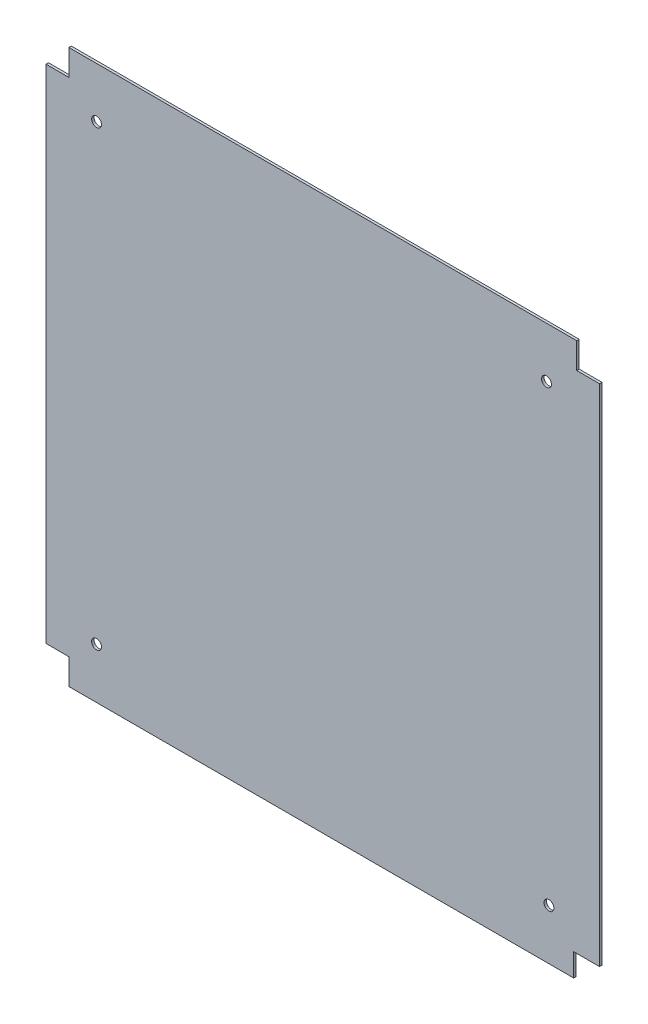
ISO-10303-21;
HEADER;
FILE_DESCRIPTION(('STEP AP214'),'2;1');
FILE_NAME('part.step','',(''),(''),'','','');
FILE_SCHEMA(('AUTOMOTIVE_DESIGN { 1 0 10303 214 1 1 1 1 }'));
ENDSEC;
DATA;
#1=APPLICATION_CONTEXT('core data for automotive mechanical design processes');
#2=APPLICATION_PROTOCOL_DEFINITION('international standard','automotive_design',2000,#1);
#3=PRODUCT_CONTEXT('',#1,'mechanical');
#4=PRODUCT('Part','Part','',(#3));
#5=PRODUCT_RELATED_PRODUCT_CATEGORY('part','',(#4));
#6=PRODUCT_DEFINITION_FORMATION('','',#4);
#7=PRODUCT_DEFINITION_CONTEXT('part definition',#1,'design');
#8=PRODUCT_DEFINITION('design','',#6,#7);
#9=PRODUCT_DEFINITION_SHAPE('','',#8);
#10=(LENGTH_UNIT() NAMED_UNIT(*) SI_UNIT(.MILLI.,.METRE.));
#11=(NAMED_UNIT(*) PLANE_ANGLE_UNIT() SI_UNIT($,.RADIAN.));
#12=(NAMED_UNIT(*) SI_UNIT($,.STERADIAN.) SOLID_ANGLE_UNIT());
#13=UNCERTAINTY_MEASURE_WITH_UNIT(LENGTH_MEASURE(1.E-05),#10,'distance_accuracy_value','');
#14=(GEOMETRIC_REPRESENTATION_CONTEXT(3) GLOBAL_UNCERTAINTY_ASSIGNED_CONTEXT((#13)) GLOBAL_UNIT_ASSIGNED_CONTEXT((#10,
#11,#12)) REPRESENTATION_CONTEXT('',''));
#15=CARTESIAN_POINT('',(0.,0.,0.));
#16=DIRECTION('',(0.,0.,1.));
#17=DIRECTION('',(1.,0.,0.));
#18=AXIS2_PLACEMENT_3D('',#15,#16,#17);
#19=CARTESIAN_POINT('',(0.,0.,-2.));
#20=DIRECTION('',(0.,0.,-1.));
#21=DIRECTION('',(-1.,0.,0.));
#22=AXIS2_PLACEMENT_3D('',#19,#20,#21);
#23=PLANE('',#22);
#24=DIRECTION('',(0.,1.,0.));
#25=VECTOR('',#24,1.);
#26=CARTESIAN_POINT('',(-205.,-207.248893571891,-2.00000000000002));
#27=LINE('',#26,#25);
#28=CARTESIAN_POINT('',(-205.,-225.497787143782,-2.00000000000017));
#29=VERTEX_POINT('',#28);
#30=CARTESIAN_POINT('',(-205.,-204.5,-2.00000000000002));
#31=VERTEX_POINT('',#30);
#32=EDGE_CURVE('E226',#29,#31,#27,.T.);
#33=ORIENTED_EDGE('',*,*,#32,.T.);
#34=DIRECTION('',(-1.,0.,0.));
#35=VECTOR('',#34,1.);
#36=CARTESIAN_POINT('',(-205.248893571891,-204.5,-2.00000000000005));
#37=LINE('',#36,#35);
#38=CARTESIAN_POINT('',(-223.497787143782,-204.5,-2.00000000000014));
#39=VERTEX_POINT('',#38);
#40=EDGE_CURVE('E91',#31,#39,#37,.T.);
#41=ORIENTED_EDGE('',*,*,#40,.T.);
#42=DIRECTION('',(0.,-1.,0.));
#43=VECTOR('',#42,1.);
#44=CARTESIAN_POINT('',(-223.497787143782,-204.5,-2.00000000000014));
#45=LINE('',#44,#43);
#46=CARTESIAN_POINT('',(-223.497787143782,202.5,-2.00000000000025));
#47=VERTEX_POINT('',#46);
#48=EDGE_CURVE('E229',#47,#39,#45,.T.);
#49=ORIENTED_EDGE('',*,*,#48,.F.);
#50=DIRECTION('',(-1.,0.,0.));
#51=VECTOR('',#50,1.);
#52=CARTESIAN_POINT('',(-205.248893571891,202.5,-2.00000000000005));
#53=LINE('',#52,#51);
#54=CARTESIAN_POINT('',(-205.,202.5,-2.00000000000003));
#55=VERTEX_POINT('',#54);
#56=EDGE_CURVE('E78',#47,#55,#53,.F.);
#57=ORIENTED_EDGE('',*,*,#56,.T.);
#58=DIRECTION('',(0.,1.,0.));
#59=VECTOR('',#58,1.);
#60=CARTESIAN_POINT('',(-205.,205.248893571891,-2.00000000000003));
#61=LINE('',#60,#59);
#62=CARTESIAN_POINT('',(-205.,223.497787143782,-2.00000000000017));
#63=VERTEX_POINT('',#62);
#64=EDGE_CURVE('E169',#55,#63,#61,.T.);
#65=ORIENTED_EDGE('',*,*,#64,.T.);
#66=DIRECTION('',(-1.,0.,0.));
#67=VECTOR('',#66,1.);
#68=CARTESIAN_POINT('',(-205.,223.497787143782,-2.00000000000017));
#69=LINE('',#68,#67);
#70=CARTESIAN_POINT('',(207.,223.497787143782,-2.00000000000014));
#71=VERTEX_POINT('',#70);
#72=EDGE_CURVE('E175',#71,#63,#69,.T.);
#73=ORIENTED_EDGE('',*,*,#72,.F.);
#74=DIRECTION('',(0.,1.,0.));
#75=VECTOR('',#74,1.);
#76=CARTESIAN_POINT('',(207.,205.248893571891,-2.00000000000003));
#77=LINE('',#76,#75);
#78=CARTESIAN_POINT('',(207.,202.5,-2.00000000000003));
#79=VERTEX_POINT('',#78);
#80=EDGE_CURVE('E160',#71,#79,#77,.F.);
#81=ORIENTED_EDGE('',*,*,#80,.T.);
#82=DIRECTION('',(-1.,0.,0.));
#83=VECTOR('',#82,1.);
#84=CARTESIAN_POINT('',(207.248893571891,202.5,-1.99999999999999));
#85=LINE('',#84,#83);
#86=CARTESIAN_POINT('',(225.497787143782,202.5,-2.00000000000014));
#87=VERTEX_POINT('',#86);
#88=EDGE_CURVE('E203',#79,#87,#85,.F.);
#89=ORIENTED_EDGE('',*,*,#88,.T.);
#90=DIRECTION('',(0.,1.,0.));
#91=VECTOR('',#90,1.);
#92=CARTESIAN_POINT('',(225.497787143782,202.5,-2.00000000000014));
#93=LINE('',#92,#91);
#94=CARTESIAN_POINT('',(225.497787143782,-207.,-2.0000000000002));
#95=VERTEX_POINT('',#94);
#96=EDGE_CURVE('E168',#95,#87,#93,.T.);
#97=ORIENTED_EDGE('',*,*,#96,.F.);
#98=DIRECTION('',(-1.,0.,0.));
#99=VECTOR('',#98,1.);
#100=CARTESIAN_POINT('',(207.248893571891,-207.,-1.99999999999999));
#101=LINE('',#100,#99);
#102=CARTESIAN_POINT('',(204.5,-207.,-1.99999999999999));
#103=VERTEX_POINT('',#102);
#104=EDGE_CURVE('E205',#95,#103,#101,.T.);
#105=ORIENTED_EDGE('',*,*,#104,.T.);
#106=DIRECTION('',(0.,1.,0.));
#107=VECTOR('',#106,1.);
#108=CARTESIAN_POINT('',(204.5,-207.248893571891,-2.00000000000002));
#109=LINE('',#108,#107);
#110=CARTESIAN_POINT('',(204.5,-225.497787143782,-2.00000000000011));
#111=VERTEX_POINT('',#110);
#112=EDGE_CURVE('E224',#103,#111,#109,.F.);
#113=ORIENTED_EDGE('',*,*,#112,.T.);
#114=DIRECTION('',(1.,0.,0.));
#115=VECTOR('',#114,1.);
#116=CARTESIAN_POINT('',(204.5,-225.497787143782,-2.00000000000011));
#117=LINE('',#116,#115);
#118=EDGE_CURVE('E209',#29,#111,#117,.T.);
#119=ORIENTED_EDGE('',*,*,#118,.F.);
#120=EDGE_LOOP('',(#33,#41,#49,#57,#65,#73,#81,#89,#97,#105,#113,#119));
#121=FACE_BOUND('',#120,.T.);
#122=CARTESIAN_POINT('',(-182.5,-184.5,-2.));
#123=DIRECTION('',(0.,0.,-1.));
#124=DIRECTION('',(-1.,0.,0.));
#125=AXIS2_PLACEMENT_3D('',#122,#123,#124);
#126=CIRCLE('',#125,3.99999999999999);
#127=CARTESIAN_POINT('',(-186.5,-184.5,-2.));
#128=VERTEX_POINT('',#127);
#129=EDGE_CURVE('E248',#128,#128,#126,.T.);
#130=ORIENTED_EDGE('',*,*,#129,.F.);
#131=EDGE_LOOP('',(#130));
#132=FACE_BOUND('',#131,.T.);
#133=CARTESIAN_POINT('',(-182.5,182.5,-2.));
#134=DIRECTION('',(0.,0.,-1.));
#135=DIRECTION('',(-1.,0.,0.));
#136=AXIS2_PLACEMENT_3D('',#133,#134,#135);
#137=CIRCLE('',#136,3.99999999999999);
#138=CARTESIAN_POINT('',(-186.5,182.5,-2.));
#139=VERTEX_POINT('',#138);
#140=EDGE_CURVE('E252',#139,#139,#137,.T.);
#141=ORIENTED_EDGE('',*,*,#140,.F.);
#142=EDGE_LOOP('',(#141));
#143=FACE_BOUND('',#142,.T.);
#144=CARTESIAN_POINT('',(182.5,182.5,-2.));
#145=DIRECTION('',(0.,0.,-1.));
#146=DIRECTION('',(-1.,0.,0.));
#147=AXIS2_PLACEMENT_3D('',#144,#145,#146);
#148=CIRCLE('',#147,3.99999999999999);
#149=CARTESIAN_POINT('',(178.5,182.5,-2.));
#150=VERTEX_POINT('',#149);
#151=EDGE_CURVE('E244',#150,#150,#148,.T.);
#152=ORIENTED_EDGE('',*,*,#151,.F.);
#153=EDGE_LOOP('',(#152));
#154=FACE_BOUND('',#153,.T.);
#155=CARTESIAN_POINT('',(184.5,-184.5,-2.));
#156=DIRECTION('',(0.,0.,-1.));
#157=DIRECTION('',(-1.,0.,0.));
#158=AXIS2_PLACEMENT_3D('',#155,#156,#157);
#159=CIRCLE('',#158,3.99999999999999);
#160=CARTESIAN_POINT('',(180.5,-184.5,-2.));
#161=VERTEX_POINT('',#160);
#162=EDGE_CURVE('E257',#161,#161,#159,.T.);
#163=ORIENTED_EDGE('',*,*,#162,.F.);
#164=EDGE_LOOP('',(#163));
#165=FACE_BOUND('',#164,.T.);
#166=ADVANCED_FACE('F61',(#121,#132,#143,#154,#165),#23,.T.);
#167=CARTESIAN_POINT('',(0.,0.,0.));
#168=DIRECTION('',(0.,0.,-1.));
#169=DIRECTION('',(-1.,0.,0.));
#170=AXIS2_PLACEMENT_3D('',#167,#168,#169);
#171=PLANE('',#170);
#172=DIRECTION('',(-1.,0.,0.));
#173=VECTOR('',#172,1.);
#174=CARTESIAN_POINT('',(-205.248893571891,-204.5,0.));
#175=LINE('',#174,#173);
#176=CARTESIAN_POINT('',(-205.,-204.5,0.));
#177=VERTEX_POINT('',#176);
#178=CARTESIAN_POINT('',(-223.497787143782,-204.5,-1.38777878078145E-13));
#179=VERTEX_POINT('',#178);
#180=EDGE_CURVE('E98',#177,#179,#175,.T.);
#181=ORIENTED_EDGE('',*,*,#180,.F.);
#182=DIRECTION('',(0.,1.,0.));
#183=VECTOR('',#182,1.);
#184=CARTESIAN_POINT('',(-205.,-207.248893571891,0.));
#185=LINE('',#184,#183);
#186=CARTESIAN_POINT('',(-205.,-225.497787143782,-1.66533453693773E-13));
#187=VERTEX_POINT('',#186);
#188=EDGE_CURVE('E227',#187,#177,#185,.T.);
#189=ORIENTED_EDGE('',*,*,#188,.F.);
#190=DIRECTION('',(1.,0.,0.));
#191=VECTOR('',#190,1.);
#192=CARTESIAN_POINT('',(204.5,-225.497787143782,-1.11022302462516E-13));
#193=LINE('',#192,#191);
#194=CARTESIAN_POINT('',(204.5,-225.497787143782,-1.11022302462516E-13));
#195=VERTEX_POINT('',#194);
#196=EDGE_CURVE('E216',#187,#195,#193,.T.);
#197=ORIENTED_EDGE('',*,*,#196,.T.);
#198=DIRECTION('',(0.,1.,0.));
#199=VECTOR('',#198,1.);
#200=CARTESIAN_POINT('',(204.5,-207.248893571891,0.));
#201=LINE('',#200,#199);
#202=CARTESIAN_POINT('',(204.5,-207.,0.));
#203=VERTEX_POINT('',#202);
#204=EDGE_CURVE('E215',#203,#195,#201,.F.);
#205=ORIENTED_EDGE('',*,*,#204,.F.);
#206=DIRECTION('',(-1.,0.,0.));
#207=VECTOR('',#206,1.);
#208=CARTESIAN_POINT('',(207.248893571891,-207.,0.));
#209=LINE('',#208,#207);
#210=CARTESIAN_POINT('',(225.497787143782,-207.,-1.94289029309402E-13));
#211=VERTEX_POINT('',#210);
#212=EDGE_CURVE('E206',#211,#203,#209,.T.);
#213=ORIENTED_EDGE('',*,*,#212,.F.);
#214=DIRECTION('',(0.,1.,0.));
#215=VECTOR('',#214,1.);
#216=CARTESIAN_POINT('',(225.497787143782,202.5,-1.38777878078145E-13));
#217=LINE('',#216,#215);
#218=CARTESIAN_POINT('',(225.497787143782,202.5,-1.38777878078145E-13));
#219=VERTEX_POINT('',#218);
#220=EDGE_CURVE('E195',#211,#219,#217,.T.);
#221=ORIENTED_EDGE('',*,*,#220,.T.);
#222=DIRECTION('',(-1.,0.,0.));
#223=VECTOR('',#222,1.);
#224=CARTESIAN_POINT('',(207.248893571891,202.5,0.));
#225=LINE('',#224,#223);
#226=CARTESIAN_POINT('',(207.,202.5,0.));
#227=VERTEX_POINT('',#226);
#228=EDGE_CURVE('E194',#227,#219,#225,.F.);
#229=ORIENTED_EDGE('',*,*,#228,.F.);
#230=DIRECTION('',(0.,1.,0.));
#231=VECTOR('',#230,1.);
#232=CARTESIAN_POINT('',(207.,205.248893571891,0.));
#233=LINE('',#232,#231);
#234=CARTESIAN_POINT('',(207.,223.497787143782,-1.38777878078145E-13));
#235=VERTEX_POINT('',#234);
#236=EDGE_CURVE('E187',#235,#227,#233,.F.);
#237=ORIENTED_EDGE('',*,*,#236,.F.);
#238=DIRECTION('',(-1.,0.,0.));
#239=VECTOR('',#238,1.);
#240=CARTESIAN_POINT('',(-205.,223.497787143782,-1.66533453693773E-13));
#241=LINE('',#240,#239);
#242=CARTESIAN_POINT('',(-205.,223.497787143782,-1.66533453693773E-13));
#243=VERTEX_POINT('',#242);
#244=EDGE_CURVE('E177',#235,#243,#241,.T.);
#245=ORIENTED_EDGE('',*,*,#244,.T.);
#246=DIRECTION('',(0.,1.,0.));
#247=VECTOR('',#246,1.);
#248=CARTESIAN_POINT('',(-205.,205.248893571891,0.));
#249=LINE('',#248,#247);
#250=CARTESIAN_POINT('',(-205.,202.5,0.));
#251=VERTEX_POINT('',#250);
#252=EDGE_CURVE('E178',#251,#243,#249,.T.);
#253=ORIENTED_EDGE('',*,*,#252,.F.);
#254=DIRECTION('',(-1.,0.,0.));
#255=VECTOR('',#254,1.);
#256=CARTESIAN_POINT('',(-205.248893571891,202.5,0.));
#257=LINE('',#256,#255);
#258=CARTESIAN_POINT('',(-223.497787143782,202.5,-2.4980018054066E-13));
#259=VERTEX_POINT('',#258);
#260=EDGE_CURVE('E242',#259,#251,#257,.F.);
#261=ORIENTED_EDGE('',*,*,#260,.F.);
#262=DIRECTION('',(0.,-1.,0.));
#263=VECTOR('',#262,1.);
#264=CARTESIAN_POINT('',(-223.497787143782,-204.5,-1.38777878078145E-13));
#265=LINE('',#264,#263);
#266=EDGE_CURVE('E234',#259,#179,#265,.T.);
#267=ORIENTED_EDGE('',*,*,#266,.T.);
#268=EDGE_LOOP('',(#181,#189,#197,#205,#213,#221,#229,#237,#245,#253,#261,#267));
#269=FACE_BOUND('',#268,.T.);
#270=CARTESIAN_POINT('',(-182.5,-184.5,0.));
#271=DIRECTION('',(0.,0.,-1.));
#272=DIRECTION('',(-1.,0.,0.));
#273=AXIS2_PLACEMENT_3D('',#270,#271,#272);
#274=CIRCLE('',#273,3.99999999999999);
#275=CARTESIAN_POINT('',(-186.5,-184.5,0.));
#276=VERTEX_POINT('',#275);
#277=EDGE_CURVE('E261',#276,#276,#274,.T.);
#278=ORIENTED_EDGE('',*,*,#277,.T.);
#279=EDGE_LOOP('',(#278));
#280=FACE_BOUND('',#279,.T.);
#281=CARTESIAN_POINT('',(-182.5,182.5,0.));
#282=DIRECTION('',(0.,0.,-1.));
#283=DIRECTION('',(-1.,0.,0.));
#284=AXIS2_PLACEMENT_3D('',#281,#282,#283);
#285=CIRCLE('',#284,3.99999999999999);
#286=CARTESIAN_POINT('',(-186.5,182.5,0.));
#287=VERTEX_POINT('',#286);
#288=EDGE_CURVE('E266',#287,#287,#285,.T.);
#289=ORIENTED_EDGE('',*,*,#288,.T.);
#290=EDGE_LOOP('',(#289));
#291=FACE_BOUND('',#290,.T.);
#292=CARTESIAN_POINT('',(182.5,182.5,0.));
#293=DIRECTION('',(0.,0.,-1.));
#294=DIRECTION('',(-1.,0.,0.));
#295=AXIS2_PLACEMENT_3D('',#292,#293,#294);
#296=CIRCLE('',#295,3.99999999999999);
#297=CARTESIAN_POINT('',(178.5,182.5,0.));
#298=VERTEX_POINT('',#297);
#299=EDGE_CURVE('E251',#298,#298,#296,.T.);
#300=ORIENTED_EDGE('',*,*,#299,.T.);
#301=EDGE_LOOP('',(#300));
#302=FACE_BOUND('',#301,.T.);
#303=CARTESIAN_POINT('',(184.5,-184.5,0.));
#304=DIRECTION('',(0.,0.,-1.));
#305=DIRECTION('',(-1.,0.,0.));
#306=AXIS2_PLACEMENT_3D('',#303,#304,#305);
#307=CIRCLE('',#306,3.99999999999999);
#308=CARTESIAN_POINT('',(180.5,-184.5,0.));
#309=VERTEX_POINT('',#308);
#310=EDGE_CURVE('E260',#309,#309,#307,.T.);
#311=ORIENTED_EDGE('',*,*,#310,.T.);
#312=EDGE_LOOP('',(#311));
#313=FACE_BOUND('',#312,.T.);
#314=ADVANCED_FACE('F63',(#269,#280,#291,#302,#313),#171,.F.);
#315=CARTESIAN_POINT('',(184.5,-184.5,8.));
#316=DIRECTION('',(0.,0.,-1.));
#317=DIRECTION('',(-1.,0.,0.));
#318=AXIS2_PLACEMENT_3D('',#315,#316,#317);
#319=CYLINDRICAL_SURFACE('',#318,3.99999999999999);
#320=ORIENTED_EDGE('',*,*,#162,.T.);
#321=EDGE_LOOP('',(#320));
#322=FACE_BOUND('',#321,.T.);
#323=ORIENTED_EDGE('',*,*,#310,.F.);
#324=EDGE_LOOP('',(#323));
#325=FACE_BOUND('',#324,.T.);
#326=ADVANCED_FACE('F323',(#322,#325),#319,.F.);
#327=CARTESIAN_POINT('',(182.5,182.5,8.));
#328=DIRECTION('',(0.,0.,-1.));
#329=DIRECTION('',(-1.,0.,0.));
#330=AXIS2_PLACEMENT_3D('',#327,#328,#329);
#331=CYLINDRICAL_SURFACE('',#330,3.99999999999999);
#332=ORIENTED_EDGE('',*,*,#151,.T.);
#333=EDGE_LOOP('',(#332));
#334=FACE_BOUND('',#333,.T.);
#335=ORIENTED_EDGE('',*,*,#299,.F.);
#336=EDGE_LOOP('',(#335));
#337=FACE_BOUND('',#336,.T.);
#338=ADVANCED_FACE('F327',(#334,#337),#331,.F.);
#339=CARTESIAN_POINT('',(-182.5,182.5,8.));
#340=DIRECTION('',(0.,0.,-1.));
#341=DIRECTION('',(-1.,0.,0.));
#342=AXIS2_PLACEMENT_3D('',#339,#340,#341);
#343=CYLINDRICAL_SURFACE('',#342,3.99999999999999);
#344=ORIENTED_EDGE('',*,*,#140,.T.);
#345=EDGE_LOOP('',(#344));
#346=FACE_BOUND('',#345,.T.);
#347=ORIENTED_EDGE('',*,*,#288,.F.);
#348=EDGE_LOOP('',(#347));
#349=FACE_BOUND('',#348,.T.);
#350=ADVANCED_FACE('F331',(#346,#349),#343,.F.);
#351=CARTESIAN_POINT('',(-182.5,-184.5,8.));
#352=DIRECTION('',(0.,0.,-1.));
#353=DIRECTION('',(-1.,0.,0.));
#354=AXIS2_PLACEMENT_3D('',#351,#352,#353);
#355=CYLINDRICAL_SURFACE('',#354,3.99999999999999);
#356=ORIENTED_EDGE('',*,*,#129,.T.);
#357=EDGE_LOOP('',(#356));
#358=FACE_BOUND('',#357,.T.);
#359=ORIENTED_EDGE('',*,*,#277,.F.);
#360=EDGE_LOOP('',(#359));
#361=FACE_BOUND('',#360,.T.);
#362=ADVANCED_FACE('F335',(#358,#361),#355,.F.);
#363=CARTESIAN_POINT('',(-205.248893571891,-204.5,-1.00000000000005));
#364=DIRECTION('',(0.,-1.,0.));
#365=DIRECTION('',(-1.,0.,0.));
#366=AXIS2_PLACEMENT_3D('',#363,#364,#365);
#367=PLANE('',#366);
#368=DIRECTION('',(0.,0.,-1.));
#369=VECTOR('',#368,1.);
#370=CARTESIAN_POINT('',(-205.,-204.5,0.));
#371=LINE('',#370,#369);
#372=EDGE_CURVE('E104',#177,#31,#371,.T.);
#373=ORIENTED_EDGE('',*,*,#372,.F.);
#374=ORIENTED_EDGE('',*,*,#180,.T.);
#375=DIRECTION('',(0.,0.,1.));
#376=VECTOR('',#375,1.);
#377=CARTESIAN_POINT('',(-223.497787143782,-204.5,-2.00000000000014));
#378=LINE('',#377,#376);
#379=EDGE_CURVE('E237',#39,#179,#378,.T.);
#380=ORIENTED_EDGE('',*,*,#379,.F.);
#381=ORIENTED_EDGE('',*,*,#40,.F.);
#382=EDGE_LOOP('',(#373,#374,#380,#381));
#383=FACE_BOUND('',#382,.T.);
#384=ADVANCED_FACE('F303',(#383),#367,.T.);
#385=CARTESIAN_POINT('',(-205.248893571891,202.5,-1.00000000000005));
#386=DIRECTION('',(0.,-1.,0.));
#387=DIRECTION('',(-1.,0.,0.));
#388=AXIS2_PLACEMENT_3D('',#385,#386,#387);
#389=PLANE('',#388);
#390=ORIENTED_EDGE('',*,*,#260,.T.);
#391=DIRECTION('',(0.,0.,-1.));
#392=VECTOR('',#391,1.);
#393=CARTESIAN_POINT('',(-205.,202.5,0.));
#394=LINE('',#393,#392);
#395=EDGE_CURVE('E70',#251,#55,#394,.T.);
#396=ORIENTED_EDGE('',*,*,#395,.T.);
#397=ORIENTED_EDGE('',*,*,#56,.F.);
#398=DIRECTION('',(0.,0.,1.));
#399=VECTOR('',#398,1.);
#400=CARTESIAN_POINT('',(-223.497787143782,202.5,-2.00000000000025));
#401=LINE('',#400,#399);
#402=EDGE_CURVE('E232',#47,#259,#401,.T.);
#403=ORIENTED_EDGE('',*,*,#402,.T.);
#404=EDGE_LOOP('',(#390,#396,#397,#403));
#405=FACE_BOUND('',#404,.T.);
#406=ADVANCED_FACE('F273',(#405),#389,.F.);
#407=CARTESIAN_POINT('',(-223.497787143782,-204.5,-2.00000000000014));
#408=DIRECTION('',(-1.,0.,0.));
#409=DIRECTION('',(0.,0.,1.));
#410=AXIS2_PLACEMENT_3D('',#407,#408,#409);
#411=PLANE('',#410);
#412=ORIENTED_EDGE('',*,*,#266,.F.);
#413=ORIENTED_EDGE('',*,*,#402,.F.);
#414=ORIENTED_EDGE('',*,*,#48,.T.);
#415=ORIENTED_EDGE('',*,*,#379,.T.);
#416=EDGE_LOOP('',(#412,#413,#414,#415));
#417=FACE_BOUND('',#416,.T.);
#418=ADVANCED_FACE('F305',(#417),#411,.T.);
#419=CARTESIAN_POINT('',(204.5,-207.248893571891,-1.00000000000002));
#420=DIRECTION('',(-1.,0.,0.));
#421=DIRECTION('',(0.,1.,0.));
#422=AXIS2_PLACEMENT_3D('',#419,#420,#421);
#423=PLANE('',#422);
#424=DIRECTION('',(0.,0.,-1.));
#425=VECTOR('',#424,1.);
#426=CARTESIAN_POINT('',(204.5,-207.,0.));
#427=LINE('',#426,#425);
#428=EDGE_CURVE('E272',#203,#103,#427,.T.);
#429=ORIENTED_EDGE('',*,*,#428,.F.);
#430=ORIENTED_EDGE('',*,*,#204,.T.);
#431=DIRECTION('',(0.,0.,1.));
#432=VECTOR('',#431,1.);
#433=CARTESIAN_POINT('',(204.5,-225.497787143782,-2.00000000000011));
#434=LINE('',#433,#432);
#435=EDGE_CURVE('E219',#111,#195,#434,.T.);
#436=ORIENTED_EDGE('',*,*,#435,.F.);
#437=ORIENTED_EDGE('',*,*,#112,.F.);
#438=EDGE_LOOP('',(#429,#430,#436,#437));
#439=FACE_BOUND('',#438,.T.);
#440=ADVANCED_FACE('F294',(#439),#423,.F.);
#441=CARTESIAN_POINT('',(-205.,-207.248893571891,-1.00000000000002));
#442=DIRECTION('',(-1.,0.,0.));
#443=DIRECTION('',(0.,1.,0.));
#444=AXIS2_PLACEMENT_3D('',#441,#442,#443);
#445=PLANE('',#444);
#446=ORIENTED_EDGE('',*,*,#188,.T.);
#447=ORIENTED_EDGE('',*,*,#372,.T.);
#448=ORIENTED_EDGE('',*,*,#32,.F.);
#449=DIRECTION('',(0.,0.,1.));
#450=VECTOR('',#449,1.);
#451=CARTESIAN_POINT('',(-205.,-225.497787143782,-2.00000000000017));
#452=LINE('',#451,#450);
#453=EDGE_CURVE('E212',#29,#187,#452,.T.);
#454=ORIENTED_EDGE('',*,*,#453,.T.);
#455=EDGE_LOOP('',(#446,#447,#448,#454));
#456=FACE_BOUND('',#455,.T.);
#457=ADVANCED_FACE('F301',(#456),#445,.T.);
#458=CARTESIAN_POINT('',(204.5,-225.497787143782,-2.00000000000011));
#459=DIRECTION('',(0.,-1.,0.));
#460=DIRECTION('',(0.,0.,-1.));
#461=AXIS2_PLACEMENT_3D('',#458,#459,#460);
#462=PLANE('',#461);
#463=ORIENTED_EDGE('',*,*,#196,.F.);
#464=ORIENTED_EDGE('',*,*,#453,.F.);
#465=ORIENTED_EDGE('',*,*,#118,.T.);
#466=ORIENTED_EDGE('',*,*,#435,.T.);
#467=EDGE_LOOP('',(#463,#464,#465,#466));
#468=FACE_BOUND('',#467,.T.);
#469=ADVANCED_FACE('F300',(#468),#462,.T.);
#470=CARTESIAN_POINT('',(207.248893571891,202.5,-0.999999999999992));
#471=DIRECTION('',(0.,-1.,0.));
#472=DIRECTION('',(-1.,0.,0.));
#473=AXIS2_PLACEMENT_3D('',#470,#471,#472);
#474=PLANE('',#473);
#475=DIRECTION('',(0.,0.,-1.));
#476=VECTOR('',#475,1.);
#477=CARTESIAN_POINT('',(207.,202.5,0.));
#478=LINE('',#477,#476);
#479=EDGE_CURVE('E12',#227,#79,#478,.T.);
#480=ORIENTED_EDGE('',*,*,#479,.F.);
#481=ORIENTED_EDGE('',*,*,#228,.T.);
#482=DIRECTION('',(0.,0.,1.));
#483=VECTOR('',#482,1.);
#484=CARTESIAN_POINT('',(225.497787143782,202.5,-2.00000000000014));
#485=LINE('',#484,#483);
#486=EDGE_CURVE('E198',#87,#219,#485,.T.);
#487=ORIENTED_EDGE('',*,*,#486,.F.);
#488=ORIENTED_EDGE('',*,*,#88,.F.);
#489=EDGE_LOOP('',(#480,#481,#487,#488));
#490=FACE_BOUND('',#489,.T.);
#491=ADVANCED_FACE('F283',(#490),#474,.F.);
#492=CARTESIAN_POINT('',(207.248893571891,-207.,-0.999999999999992));
#493=DIRECTION('',(0.,-1.,0.));
#494=DIRECTION('',(-1.,0.,0.));
#495=AXIS2_PLACEMENT_3D('',#492,#493,#494);
#496=PLANE('',#495);
#497=ORIENTED_EDGE('',*,*,#212,.T.);
#498=ORIENTED_EDGE('',*,*,#428,.T.);
#499=ORIENTED_EDGE('',*,*,#104,.F.);
#500=DIRECTION('',(0.,0.,1.));
#501=VECTOR('',#500,1.);
#502=CARTESIAN_POINT('',(225.497787143782,-207.,-2.0000000000002));
#503=LINE('',#502,#501);
#504=EDGE_CURVE('E191',#95,#211,#503,.T.);
#505=ORIENTED_EDGE('',*,*,#504,.T.);
#506=EDGE_LOOP('',(#497,#498,#499,#505));
#507=FACE_BOUND('',#506,.T.);
#508=ADVANCED_FACE('F290',(#507),#496,.T.);
#509=CARTESIAN_POINT('',(225.497787143782,202.5,-2.00000000000014));
#510=DIRECTION('',(1.,0.,0.));
#511=DIRECTION('',(0.,0.,-1.));
#512=AXIS2_PLACEMENT_3D('',#509,#510,#511);
#513=PLANE('',#512);
#514=ORIENTED_EDGE('',*,*,#220,.F.);
#515=ORIENTED_EDGE('',*,*,#504,.F.);
#516=ORIENTED_EDGE('',*,*,#96,.T.);
#517=ORIENTED_EDGE('',*,*,#486,.T.);
#518=EDGE_LOOP('',(#514,#515,#516,#517));
#519=FACE_BOUND('',#518,.T.);
#520=ADVANCED_FACE('F288',(#519),#513,.T.);
#521=CARTESIAN_POINT('',(-205.,205.248893571891,-1.00000000000003));
#522=DIRECTION('',(-1.,0.,0.));
#523=DIRECTION('',(0.,1.,0.));
#524=AXIS2_PLACEMENT_3D('',#521,#522,#523);
#525=PLANE('',#524);
#526=ORIENTED_EDGE('',*,*,#395,.F.);
#527=ORIENTED_EDGE('',*,*,#252,.T.);
#528=DIRECTION('',(0.,0.,1.));
#529=VECTOR('',#528,1.);
#530=CARTESIAN_POINT('',(-205.,223.497787143782,-2.00000000000017));
#531=LINE('',#530,#529);
#532=EDGE_CURVE('E182',#63,#243,#531,.T.);
#533=ORIENTED_EDGE('',*,*,#532,.F.);
#534=ORIENTED_EDGE('',*,*,#64,.F.);
#535=EDGE_LOOP('',(#526,#527,#533,#534));
#536=FACE_BOUND('',#535,.T.);
#537=ADVANCED_FACE('F276',(#536),#525,.T.);
#538=CARTESIAN_POINT('',(207.,205.248893571891,-1.00000000000003));
#539=DIRECTION('',(-1.,0.,0.));
#540=DIRECTION('',(0.,1.,0.));
#541=AXIS2_PLACEMENT_3D('',#538,#539,#540);
#542=PLANE('',#541);
#543=ORIENTED_EDGE('',*,*,#236,.T.);
#544=ORIENTED_EDGE('',*,*,#479,.T.);
#545=ORIENTED_EDGE('',*,*,#80,.F.);
#546=DIRECTION('',(0.,0.,1.));
#547=VECTOR('',#546,1.);
#548=CARTESIAN_POINT('',(207.,223.497787143782,-2.00000000000014));
#549=LINE('',#548,#547);
#550=EDGE_CURVE('E163',#71,#235,#549,.T.);
#551=ORIENTED_EDGE('',*,*,#550,.T.);
#552=EDGE_LOOP('',(#543,#544,#545,#551));
#553=FACE_BOUND('',#552,.T.);
#554=ADVANCED_FACE('F162',(#553),#542,.F.);
#555=CARTESIAN_POINT('',(-205.,223.497787143782,-2.00000000000017));
#556=DIRECTION('',(0.,1.,0.));
#557=DIRECTION('',(0.,0.,1.));
#558=AXIS2_PLACEMENT_3D('',#555,#556,#557);
#559=PLANE('',#558);
#560=ORIENTED_EDGE('',*,*,#244,.F.);
#561=ORIENTED_EDGE('',*,*,#550,.F.);
#562=ORIENTED_EDGE('',*,*,#72,.T.);
#563=ORIENTED_EDGE('',*,*,#532,.T.);
#564=EDGE_LOOP('',(#560,#561,#562,#563));
#565=FACE_BOUND('',#564,.T.);
#566=ADVANCED_FACE('F173',(#565),#559,.T.);
#567=CLOSED_SHELL('',(#166,#314,#326,#338,#350,#362,#384,#406,#418,#440,#457,#469,#491,#508,
#520,#537,#554,#566));
#568=MANIFOLD_SOLID_BREP('B2',#567);
#569=ADVANCED_BREP_SHAPE_REPRESENTATION('',(#18,#568),#14);
#570=SHAPE_DEFINITION_REPRESENTATION(#9,#569);
ENDSEC;
END-ISO-10303-21;
